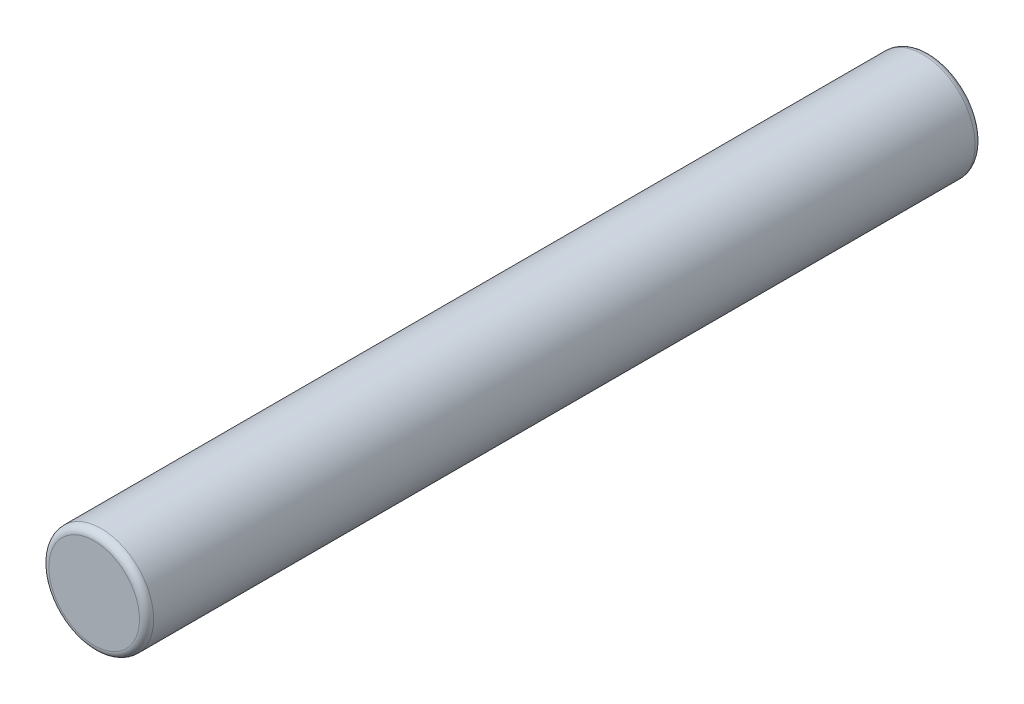
ISO-10303-21;
HEADER;
FILE_DESCRIPTION(('STEP AP214'),'2;1');
FILE_NAME('part.step','',(''),(''),'','','');
FILE_SCHEMA(('AUTOMOTIVE_DESIGN { 1 0 10303 214 1 1 1 1 }'));
ENDSEC;
DATA;
#1=APPLICATION_CONTEXT('core data for automotive mechanical design processes');
#2=APPLICATION_PROTOCOL_DEFINITION('international standard','automotive_design',2000,#1);
#3=PRODUCT_CONTEXT('',#1,'mechanical');
#4=PRODUCT('Part','Part','',(#3));
#5=PRODUCT_RELATED_PRODUCT_CATEGORY('part','',(#4));
#6=PRODUCT_DEFINITION_FORMATION('','',#4);
#7=PRODUCT_DEFINITION_CONTEXT('part definition',#1,'design');
#8=PRODUCT_DEFINITION('design','',#6,#7);
#9=PRODUCT_DEFINITION_SHAPE('','',#8);
#10=(LENGTH_UNIT() NAMED_UNIT(*) SI_UNIT(.MILLI.,.METRE.));
#11=(NAMED_UNIT(*) PLANE_ANGLE_UNIT() SI_UNIT($,.RADIAN.));
#12=(NAMED_UNIT(*) SI_UNIT($,.STERADIAN.) SOLID_ANGLE_UNIT());
#13=UNCERTAINTY_MEASURE_WITH_UNIT(LENGTH_MEASURE(1.E-05),#10,'distance_accuracy_value','');
#14=(GEOMETRIC_REPRESENTATION_CONTEXT(3) GLOBAL_UNCERTAINTY_ASSIGNED_CONTEXT((#13)) GLOBAL_UNIT_ASSIGNED_CONTEXT((#10,
#11,#12)) REPRESENTATION_CONTEXT('',''));
#15=CARTESIAN_POINT('',(0.,0.,0.));
#16=DIRECTION('',(0.,0.,1.));
#17=DIRECTION('',(1.,0.,0.));
#18=AXIS2_PLACEMENT_3D('',#15,#16,#17);
#19=CARTESIAN_POINT('',(0.,0.,59.));
#20=DIRECTION('',(0.,0.,-1.));
#21=DIRECTION('',(-1.,0.,0.));
#22=AXIS2_PLACEMENT_3D('',#19,#20,#21);
#23=CYLINDRICAL_SURFACE('',#22,3.7);
#24=CARTESIAN_POINT('',(0.,0.,0.5));
#25=DIRECTION('',(0.,0.,1.));
#26=DIRECTION('',(1.,0.,0.));
#27=AXIS2_PLACEMENT_3D('',#24,#25,#26);
#28=CIRCLE('',#27,3.7);
#29=CARTESIAN_POINT('',(3.7,0.,0.5));
#30=VERTEX_POINT('',#29);
#31=EDGE_CURVE('E56',#30,#30,#28,.T.);
#32=ORIENTED_EDGE('',*,*,#31,.T.);
#33=EDGE_LOOP('',(#32));
#34=FACE_BOUND('',#33,.T.);
#35=CARTESIAN_POINT('',(0.,0.,58.5));
#36=DIRECTION('',(0.,0.,1.));
#37=DIRECTION('',(1.,0.,0.));
#38=AXIS2_PLACEMENT_3D('',#35,#36,#37);
#39=CIRCLE('',#38,3.7);
#40=CARTESIAN_POINT('',(3.7,0.,58.5));
#41=VERTEX_POINT('',#40);
#42=EDGE_CURVE('E61',#41,#41,#39,.F.);
#43=ORIENTED_EDGE('',*,*,#42,.T.);
#44=EDGE_LOOP('',(#43));
#45=FACE_BOUND('',#44,.T.);
#46=ADVANCED_FACE('F43',(#34,#45),#23,.T.);
#47=CARTESIAN_POINT('',(0.,0.,59.));
#48=DIRECTION('',(0.,0.,1.));
#49=DIRECTION('',(1.,0.,0.));
#50=AXIS2_PLACEMENT_3D('',#47,#48,#49);
#51=PLANE('',#50);
#52=CARTESIAN_POINT('',(0.,0.,59.));
#53=DIRECTION('',(0.,0.,1.));
#54=DIRECTION('',(1.,0.,0.));
#55=AXIS2_PLACEMENT_3D('',#52,#53,#54);
#56=CIRCLE('',#55,3.2);
#57=CARTESIAN_POINT('',(3.2,0.,59.));
#58=VERTEX_POINT('',#57);
#59=EDGE_CURVE('E10',#58,#58,#56,.T.);
#60=ORIENTED_EDGE('',*,*,#59,.T.);
#61=EDGE_LOOP('',(#60));
#62=FACE_BOUND('',#61,.T.);
#63=ADVANCED_FACE('F78',(#62),#51,.T.);
#64=CARTESIAN_POINT('',(0.,0.,0.));
#65=DIRECTION('',(0.,0.,1.));
#66=DIRECTION('',(1.,0.,0.));
#67=AXIS2_PLACEMENT_3D('',#64,#65,#66);
#68=PLANE('',#67);
#69=CARTESIAN_POINT('',(0.,0.,0.));
#70=DIRECTION('',(0.,0.,1.));
#71=DIRECTION('',(1.,0.,0.));
#72=AXIS2_PLACEMENT_3D('',#69,#70,#71);
#73=CIRCLE('',#72,3.2);
#74=CARTESIAN_POINT('',(3.2,0.,0.));
#75=VERTEX_POINT('',#74);
#76=EDGE_CURVE('E51',#75,#75,#73,.F.);
#77=ORIENTED_EDGE('',*,*,#76,.T.);
#78=EDGE_LOOP('',(#77));
#79=FACE_BOUND('',#78,.T.);
#80=ADVANCED_FACE('F75',(#79),#68,.F.);
#81=CARTESIAN_POINT('',(0.,0.,0.5));
#82=DIRECTION('',(0.,0.,1.));
#83=DIRECTION('',(1.,0.,0.));
#84=AXIS2_PLACEMENT_3D('',#81,#82,#83);
#85=TOROIDAL_SURFACE('',#84,3.2,0.5);
#86=ORIENTED_EDGE('',*,*,#76,.F.);
#87=EDGE_LOOP('',(#86));
#88=FACE_BOUND('',#87,.T.);
#89=ORIENTED_EDGE('',*,*,#31,.F.);
#90=EDGE_LOOP('',(#89));
#91=FACE_BOUND('',#90,.T.);
#92=ADVANCED_FACE('F71',(#88,#91),#85,.T.);
#93=CARTESIAN_POINT('',(0.,0.,58.5));
#94=DIRECTION('',(0.,0.,1.));
#95=DIRECTION('',(1.,0.,0.));
#96=AXIS2_PLACEMENT_3D('',#93,#94,#95);
#97=TOROIDAL_SURFACE('',#96,3.2,0.5);
#98=ORIENTED_EDGE('',*,*,#42,.F.);
#99=EDGE_LOOP('',(#98));
#100=FACE_BOUND('',#99,.T.);
#101=ORIENTED_EDGE('',*,*,#59,.F.);
#102=EDGE_LOOP('',(#101));
#103=FACE_BOUND('',#102,.T.);
#104=ADVANCED_FACE('F45',(#100,#103),#97,.T.);
#105=CLOSED_SHELL('',(#46,#63,#80,#92,#104));
#106=MANIFOLD_SOLID_BREP('B2',#105);
#107=ADVANCED_BREP_SHAPE_REPRESENTATION('',(#18,#106),#14);
#108=SHAPE_DEFINITION_REPRESENTATION(#9,#107);
ENDSEC;
END-ISO-10303-21;
